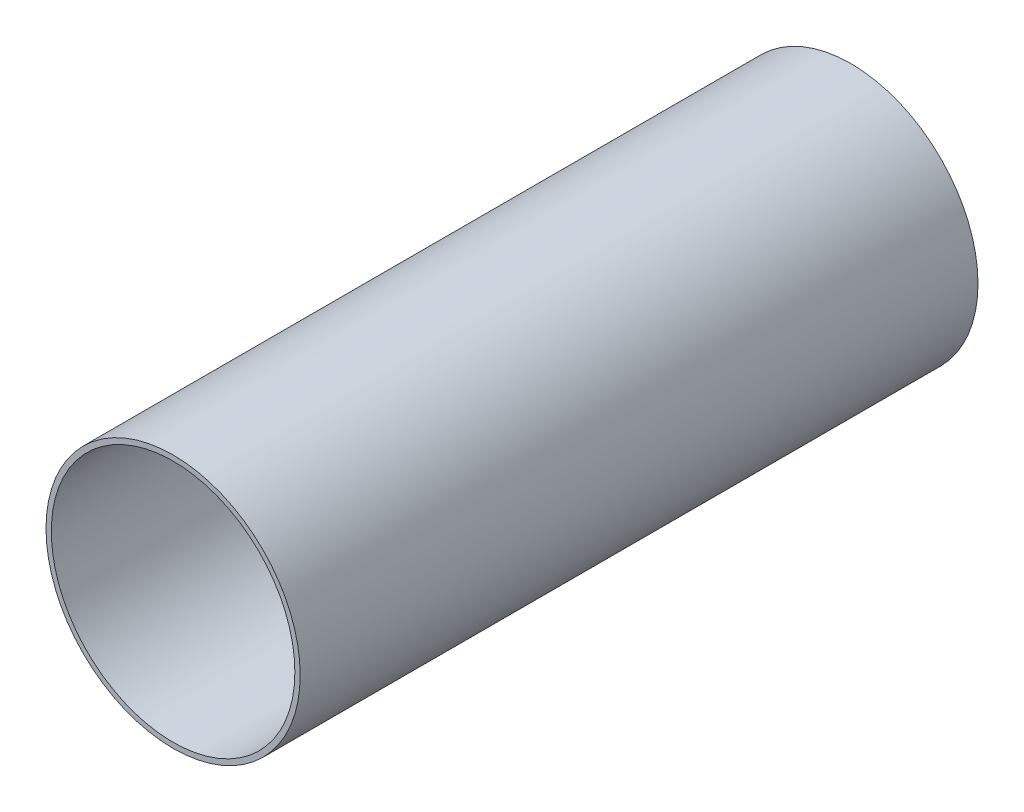
ISO-10303-21;
HEADER;
FILE_DESCRIPTION(('STEP AP214'),'2;1');
FILE_NAME('part.step','',(''),(''),'','','');
FILE_SCHEMA(('AUTOMOTIVE_DESIGN { 1 0 10303 214 1 1 1 1 }'));
ENDSEC;
DATA;
#1=APPLICATION_CONTEXT('core data for automotive mechanical design processes');
#2=APPLICATION_PROTOCOL_DEFINITION('international standard','automotive_design',2000,#1);
#3=PRODUCT_CONTEXT('',#1,'mechanical');
#4=PRODUCT('Part','Part','',(#3));
#5=PRODUCT_RELATED_PRODUCT_CATEGORY('part','',(#4));
#6=PRODUCT_DEFINITION_FORMATION('','',#4);
#7=PRODUCT_DEFINITION_CONTEXT('part definition',#1,'design');
#8=PRODUCT_DEFINITION('design','',#6,#7);
#9=PRODUCT_DEFINITION_SHAPE('','',#8);
#10=(LENGTH_UNIT() NAMED_UNIT(*) SI_UNIT(.MILLI.,.METRE.));
#11=(NAMED_UNIT(*) PLANE_ANGLE_UNIT() SI_UNIT($,.RADIAN.));
#12=(NAMED_UNIT(*) SI_UNIT($,.STERADIAN.) SOLID_ANGLE_UNIT());
#13=UNCERTAINTY_MEASURE_WITH_UNIT(LENGTH_MEASURE(1.E-05),#10,'distance_accuracy_value','');
#14=(GEOMETRIC_REPRESENTATION_CONTEXT(3) GLOBAL_UNCERTAINTY_ASSIGNED_CONTEXT((#13)) GLOBAL_UNIT_ASSIGNED_CONTEXT((#10,
#11,#12)) REPRESENTATION_CONTEXT('',''));
#15=CARTESIAN_POINT('',(0.,0.,0.));
#16=DIRECTION('',(0.,0.,1.));
#17=DIRECTION('',(1.,0.,0.));
#18=AXIS2_PLACEMENT_3D('',#15,#16,#17);
#19=CARTESIAN_POINT('',(0.,0.,203.2));
#20=DIRECTION('',(0.,0.,1.));
#21=DIRECTION('',(1.,0.,0.));
#22=AXIS2_PLACEMENT_3D('',#19,#20,#21);
#23=PLANE('',#22);
#24=CARTESIAN_POINT('',(0.,0.,203.2));
#25=DIRECTION('',(0.,0.,1.));
#26=DIRECTION('',(1.,0.,0.));
#27=AXIS2_PLACEMENT_3D('',#24,#25,#26);
#28=CIRCLE('',#27,38.1);
#29=CARTESIAN_POINT('',(38.1,0.,203.2));
#30=VERTEX_POINT('',#29);
#31=EDGE_CURVE('E10',#30,#30,#28,.T.);
#32=ORIENTED_EDGE('',*,*,#31,.T.);
#33=EDGE_LOOP('',(#32));
#34=FACE_BOUND('',#33,.T.);
#35=CARTESIAN_POINT('',(0.,0.,203.2));
#36=DIRECTION('',(0.,0.,1.));
#37=DIRECTION('',(1.,0.,0.));
#38=AXIS2_PLACEMENT_3D('',#35,#36,#37);
#39=CIRCLE('',#38,36.5125);
#40=CARTESIAN_POINT('',(36.5125,0.,203.2));
#41=VERTEX_POINT('',#40);
#42=EDGE_CURVE('E48',#41,#41,#39,.T.);
#43=ORIENTED_EDGE('',*,*,#42,.F.);
#44=EDGE_LOOP('',(#43));
#45=FACE_BOUND('',#44,.T.);
#46=ADVANCED_FACE('F37',(#34,#45),#23,.T.);
#47=CARTESIAN_POINT('',(0.,0.,0.));
#48=DIRECTION('',(0.,0.,1.));
#49=DIRECTION('',(1.,0.,0.));
#50=AXIS2_PLACEMENT_3D('',#47,#48,#49);
#51=PLANE('',#50);
#52=CARTESIAN_POINT('',(0.,0.,0.));
#53=DIRECTION('',(0.,0.,1.));
#54=DIRECTION('',(1.,0.,0.));
#55=AXIS2_PLACEMENT_3D('',#52,#53,#54);
#56=CIRCLE('',#55,38.1);
#57=CARTESIAN_POINT('',(38.1,0.,0.));
#58=VERTEX_POINT('',#57);
#59=EDGE_CURVE('E41',#58,#58,#56,.T.);
#60=ORIENTED_EDGE('',*,*,#59,.F.);
#61=EDGE_LOOP('',(#60));
#62=FACE_BOUND('',#61,.T.);
#63=CARTESIAN_POINT('',(0.,0.,0.));
#64=DIRECTION('',(0.,0.,1.));
#65=DIRECTION('',(1.,0.,0.));
#66=AXIS2_PLACEMENT_3D('',#63,#64,#65);
#67=CIRCLE('',#66,36.5125);
#68=CARTESIAN_POINT('',(36.5125,0.,0.));
#69=VERTEX_POINT('',#68);
#70=EDGE_CURVE('E50',#69,#69,#67,.T.);
#71=ORIENTED_EDGE('',*,*,#70,.T.);
#72=EDGE_LOOP('',(#71));
#73=FACE_BOUND('',#72,.T.);
#74=ADVANCED_FACE('F60',(#62,#73),#51,.F.);
#75=CARTESIAN_POINT('',(0.,0.,203.2));
#76=DIRECTION('',(0.,0.,-1.));
#77=DIRECTION('',(-1.,0.,0.));
#78=AXIS2_PLACEMENT_3D('',#75,#76,#77);
#79=CYLINDRICAL_SURFACE('',#78,38.1);
#80=ORIENTED_EDGE('',*,*,#31,.F.);
#81=EDGE_LOOP('',(#80));
#82=FACE_BOUND('',#81,.T.);
#83=ORIENTED_EDGE('',*,*,#59,.T.);
#84=EDGE_LOOP('',(#83));
#85=FACE_BOUND('',#84,.T.);
#86=ADVANCED_FACE('F39',(#82,#85),#79,.T.);
#87=CARTESIAN_POINT('',(0.,0.,203.2));
#88=DIRECTION('',(0.,0.,-1.));
#89=DIRECTION('',(-1.,0.,0.));
#90=AXIS2_PLACEMENT_3D('',#87,#88,#89);
#91=CYLINDRICAL_SURFACE('',#90,36.5125);
#92=ORIENTED_EDGE('',*,*,#42,.T.);
#93=EDGE_LOOP('',(#92));
#94=FACE_BOUND('',#93,.T.);
#95=ORIENTED_EDGE('',*,*,#70,.F.);
#96=EDGE_LOOP('',(#95));
#97=FACE_BOUND('',#96,.T.);
#98=ADVANCED_FACE('F56',(#94,#97),#91,.F.);
#99=CLOSED_SHELL('',(#46,#74,#86,#98));
#100=MANIFOLD_SOLID_BREP('B2',#99);
#101=ADVANCED_BREP_SHAPE_REPRESENTATION('',(#18,#100),#14);
#102=SHAPE_DEFINITION_REPRESENTATION(#9,#101);
ENDSEC;
END-ISO-10303-21;
